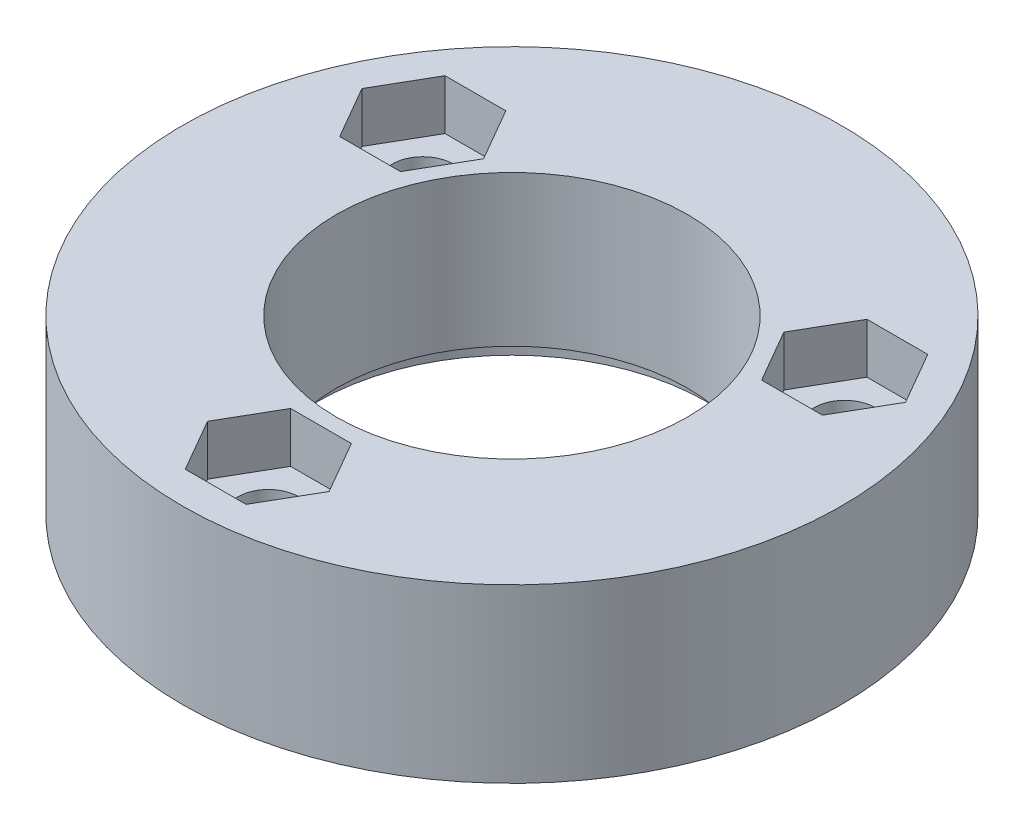
ISO-10303-21;
HEADER;
FILE_DESCRIPTION(('STEP AP214'),'2;1');
FILE_NAME('part.step','',(''),(''),'','','');
FILE_SCHEMA(('AUTOMOTIVE_DESIGN { 1 0 10303 214 1 1 1 1 }'));
ENDSEC;
DATA;
#1=APPLICATION_CONTEXT('core data for automotive mechanical design processes');
#2=APPLICATION_PROTOCOL_DEFINITION('international standard','automotive_design',2000,#1);
#3=PRODUCT_CONTEXT('',#1,'mechanical');
#4=PRODUCT('Part','Part','',(#3));
#5=PRODUCT_RELATED_PRODUCT_CATEGORY('part','',(#4));
#6=PRODUCT_DEFINITION_FORMATION('','',#4);
#7=PRODUCT_DEFINITION_CONTEXT('part definition',#1,'design');
#8=PRODUCT_DEFINITION('design','',#6,#7);
#9=PRODUCT_DEFINITION_SHAPE('','',#8);
#10=(LENGTH_UNIT() NAMED_UNIT(*) SI_UNIT(.MILLI.,.METRE.));
#11=(NAMED_UNIT(*) PLANE_ANGLE_UNIT() SI_UNIT($,.RADIAN.));
#12=(NAMED_UNIT(*) SI_UNIT($,.STERADIAN.) SOLID_ANGLE_UNIT());
#13=UNCERTAINTY_MEASURE_WITH_UNIT(LENGTH_MEASURE(1.E-05),#10,'distance_accuracy_value','');
#14=(GEOMETRIC_REPRESENTATION_CONTEXT(3) GLOBAL_UNCERTAINTY_ASSIGNED_CONTEXT((#13)) GLOBAL_UNIT_ASSIGNED_CONTEXT((#10,
#11,#12)) REPRESENTATION_CONTEXT('',''));
#15=CARTESIAN_POINT('',(0.,0.,0.));
#16=DIRECTION('',(0.,0.,1.));
#17=DIRECTION('',(1.,0.,0.));
#18=AXIS2_PLACEMENT_3D('',#15,#16,#17);
#19=CARTESIAN_POINT('',(14.7224318643355,0.,-8.49999999999986));
#20=DIRECTION('',(0.,1.,0.));
#21=DIRECTION('',(0.,0.,1.));
#22=AXIS2_PLACEMENT_3D('',#19,#20,#21);
#23=CYLINDRICAL_SURFACE('',#22,2.125);
#24=CARTESIAN_POINT('',(14.7224318643355,0.,-8.49999999999986));
#25=DIRECTION('',(0.,1.,0.));
#26=DIRECTION('',(0.,0.,1.));
#27=AXIS2_PLACEMENT_3D('',#24,#25,#26);
#28=CIRCLE('',#27,2.125);
#29=CARTESIAN_POINT('',(14.7224318643355,0.,-6.37499999999986));
#30=VERTEX_POINT('',#29);
#31=EDGE_CURVE('E391',#30,#30,#28,.T.);
#32=ORIENTED_EDGE('',*,*,#31,.F.);
#33=EDGE_LOOP('',(#32));
#34=FACE_BOUND('',#33,.T.);
#35=CARTESIAN_POINT('',(14.7224318643355,8.5,-8.49999999999986));
#36=DIRECTION('',(0.,1.,0.));
#37=DIRECTION('',(0.,0.,1.));
#38=AXIS2_PLACEMENT_3D('',#35,#36,#37);
#39=CIRCLE('',#38,2.125);
#40=CARTESIAN_POINT('',(14.7224318643355,8.5,-6.37499999999986));
#41=VERTEX_POINT('',#40);
#42=EDGE_CURVE('E53',#41,#41,#39,.F.);
#43=ORIENTED_EDGE('',*,*,#42,.F.);
#44=EDGE_LOOP('',(#43));
#45=FACE_BOUND('',#44,.T.);
#46=ADVANCED_FACE('F49',(#34,#45),#23,.F.);
#47=CARTESIAN_POINT('',(-14.7224318643354,0.,-8.50000000000007));
#48=DIRECTION('',(0.,1.,0.));
#49=DIRECTION('',(0.,0.,1.));
#50=AXIS2_PLACEMENT_3D('',#47,#48,#49);
#51=CYLINDRICAL_SURFACE('',#50,2.125);
#52=CARTESIAN_POINT('',(-14.7224318643354,0.,-8.50000000000007));
#53=DIRECTION('',(0.,1.,0.));
#54=DIRECTION('',(0.,0.,1.));
#55=AXIS2_PLACEMENT_3D('',#52,#53,#54);
#56=CIRCLE('',#55,2.125);
#57=CARTESIAN_POINT('',(-14.7224318643354,0.,-6.37500000000007));
#58=VERTEX_POINT('',#57);
#59=EDGE_CURVE('E387',#58,#58,#56,.T.);
#60=ORIENTED_EDGE('',*,*,#59,.F.);
#61=EDGE_LOOP('',(#60));
#62=FACE_BOUND('',#61,.T.);
#63=CARTESIAN_POINT('',(-14.7224318643354,8.5,-8.50000000000007));
#64=DIRECTION('',(0.,1.,0.));
#65=DIRECTION('',(0.,0.,1.));
#66=AXIS2_PLACEMENT_3D('',#63,#64,#65);
#67=CIRCLE('',#66,2.125);
#68=CARTESIAN_POINT('',(-14.7224318643354,8.5,-6.37500000000007));
#69=VERTEX_POINT('',#68);
#70=EDGE_CURVE('E415',#69,#69,#67,.F.);
#71=ORIENTED_EDGE('',*,*,#70,.F.);
#72=EDGE_LOOP('',(#71));
#73=FACE_BOUND('',#72,.T.);
#74=ADVANCED_FACE('F429',(#62,#73),#51,.F.);
#75=CARTESIAN_POINT('',(0.,0.,17.));
#76=DIRECTION('',(0.,1.,0.));
#77=DIRECTION('',(0.,0.,1.));
#78=AXIS2_PLACEMENT_3D('',#75,#76,#77);
#79=CYLINDRICAL_SURFACE('',#78,2.125);
#80=CARTESIAN_POINT('',(0.,0.,17.));
#81=DIRECTION('',(0.,1.,0.));
#82=DIRECTION('',(0.,0.,1.));
#83=AXIS2_PLACEMENT_3D('',#80,#81,#82);
#84=CIRCLE('',#83,2.125);
#85=CARTESIAN_POINT('',(0.,0.,19.125));
#86=VERTEX_POINT('',#85);
#87=EDGE_CURVE('E382',#86,#86,#84,.T.);
#88=ORIENTED_EDGE('',*,*,#87,.F.);
#89=EDGE_LOOP('',(#88));
#90=FACE_BOUND('',#89,.T.);
#91=CARTESIAN_POINT('',(0.,8.5,17.));
#92=DIRECTION('',(0.,1.,0.));
#93=DIRECTION('',(0.,0.,1.));
#94=AXIS2_PLACEMENT_3D('',#91,#92,#93);
#95=CIRCLE('',#94,2.125);
#96=CARTESIAN_POINT('',(0.,8.5,19.125));
#97=VERTEX_POINT('',#96);
#98=EDGE_CURVE('E241',#97,#97,#95,.F.);
#99=ORIENTED_EDGE('',*,*,#98,.F.);
#100=EDGE_LOOP('',(#99));
#101=FACE_BOUND('',#100,.T.);
#102=ADVANCED_FACE('F434',(#90,#101),#79,.F.);
#103=CARTESIAN_POINT('',(0.,12.,0.));
#104=DIRECTION('',(0.,-1.,0.));
#105=DIRECTION('',(0.,0.,-1.));
#106=AXIS2_PLACEMENT_3D('',#103,#104,#105);
#107=CYLINDRICAL_SURFACE('',#106,12.25);
#108=CARTESIAN_POINT('',(0.,12.,0.));
#109=DIRECTION('',(0.,1.,0.));
#110=DIRECTION('',(0.,0.,1.));
#111=AXIS2_PLACEMENT_3D('',#108,#109,#110);
#112=CIRCLE('',#111,12.25);
#113=CARTESIAN_POINT('',(0.,12.,12.25));
#114=VERTEX_POINT('',#113);
#115=EDGE_CURVE('E403',#114,#114,#112,.T.);
#116=ORIENTED_EDGE('',*,*,#115,.T.);
#117=EDGE_LOOP('',(#116));
#118=FACE_BOUND('',#117,.T.);
#119=CARTESIAN_POINT('',(0.,1.5,0.));
#120=DIRECTION('',(0.,-1.,0.));
#121=DIRECTION('',(0.,0.,-1.));
#122=AXIS2_PLACEMENT_3D('',#119,#120,#121);
#123=CIRCLE('',#122,12.25);
#124=CARTESIAN_POINT('',(0.,1.5,-12.25));
#125=VERTEX_POINT('',#124);
#126=EDGE_CURVE('E399',#125,#125,#123,.T.);
#127=ORIENTED_EDGE('',*,*,#126,.T.);
#128=EDGE_LOOP('',(#127));
#129=FACE_BOUND('',#128,.T.);
#130=ADVANCED_FACE('F448',(#118,#129),#107,.F.);
#131=CARTESIAN_POINT('',(0.,12.,0.));
#132=DIRECTION('',(0.,1.,0.));
#133=DIRECTION('',(0.,0.,1.));
#134=AXIS2_PLACEMENT_3D('',#131,#132,#133);
#135=PLANE('',#134);
#136=DIRECTION('',(0.5,0.,-0.866025403784439));
#137=VECTOR('',#136,1.);
#138=CARTESIAN_POINT('',(2.12176223927187,12.,20.675));
#139=LINE('',#138,#137);
#140=CARTESIAN_POINT('',(2.12176223927187,12.,20.675));
#141=VERTEX_POINT('',#140);
#142=CARTESIAN_POINT('',(4.24352447854375,12.,17.));
#143=VERTEX_POINT('',#142);
#144=EDGE_CURVE('E67',#141,#143,#139,.T.);
#145=ORIENTED_EDGE('',*,*,#144,.F.);
#146=DIRECTION('',(1.,0.,0.));
#147=VECTOR('',#146,1.);
#148=CARTESIAN_POINT('',(-2.12176223927188,12.,20.675));
#149=LINE('',#148,#147);
#150=CARTESIAN_POINT('',(-2.12176223927188,12.,20.675));
#151=VERTEX_POINT('',#150);
#152=EDGE_CURVE('E202',#151,#141,#149,.T.);
#153=ORIENTED_EDGE('',*,*,#152,.F.);
#154=DIRECTION('',(0.5,0.,0.866025403784439));
#155=VECTOR('',#154,1.);
#156=CARTESIAN_POINT('',(-4.24352447854375,12.,17.));
#157=LINE('',#156,#155);
#158=CARTESIAN_POINT('',(-4.24352447854375,12.,17.));
#159=VERTEX_POINT('',#158);
#160=EDGE_CURVE('E209',#159,#151,#157,.T.);
#161=ORIENTED_EDGE('',*,*,#160,.F.);
#162=DIRECTION('',(-0.5,0.,0.866025403784439));
#163=VECTOR('',#162,1.);
#164=CARTESIAN_POINT('',(-2.12176223927187,12.,13.325));
#165=LINE('',#164,#163);
#166=CARTESIAN_POINT('',(-2.12176223927187,12.,13.325));
#167=VERTEX_POINT('',#166);
#168=EDGE_CURVE('E231',#167,#159,#165,.T.);
#169=ORIENTED_EDGE('',*,*,#168,.F.);
#170=DIRECTION('',(-1.,0.,0.));
#171=VECTOR('',#170,1.);
#172=CARTESIAN_POINT('',(2.12176223927187,12.,13.325));
#173=LINE('',#172,#171);
#174=CARTESIAN_POINT('',(2.12176223927187,12.,13.325));
#175=VERTEX_POINT('',#174);
#176=EDGE_CURVE('E227',#175,#167,#173,.T.);
#177=ORIENTED_EDGE('',*,*,#176,.F.);
#178=DIRECTION('',(-0.5,0.,-0.866025403784438));
#179=VECTOR('',#178,1.);
#180=CARTESIAN_POINT('',(4.24352447854375,12.,17.));
#181=LINE('',#180,#179);
#182=EDGE_CURVE('E224',#143,#175,#181,.T.);
#183=ORIENTED_EDGE('',*,*,#182,.F.);
#184=EDGE_LOOP('',(#145,#153,#161,#169,#177,#183));
#185=FACE_BOUND('',#184,.T.);
#186=DIRECTION('',(0.499999999999996,0.,0.866025403784441));
#187=VECTOR('',#186,1.);
#188=CARTESIAN_POINT('',(-18.9659563428792,12.,-8.50000000000009));
#189=LINE('',#188,#187);
#190=CARTESIAN_POINT('',(-18.9659563428792,12.,-8.50000000000009));
#191=VERTEX_POINT('',#190);
#192=CARTESIAN_POINT('',(-16.8441941036073,12.,-4.82500000000008));
#193=VERTEX_POINT('',#192);
#194=EDGE_CURVE('E75',#191,#193,#189,.T.);
#195=ORIENTED_EDGE('',*,*,#194,.F.);
#196=DIRECTION('',(-0.500000000000004,0.,0.866025403784436));
#197=VECTOR('',#196,1.);
#198=CARTESIAN_POINT('',(-16.8441941036073,12.,-12.1750000000001));
#199=LINE('',#198,#197);
#200=CARTESIAN_POINT('',(-16.8441941036073,12.,-12.1750000000001));
#201=VERTEX_POINT('',#200);
#202=EDGE_CURVE('E273',#201,#191,#199,.T.);
#203=ORIENTED_EDGE('',*,*,#202,.F.);
#204=DIRECTION('',(-1.,0.,0.));
#205=VECTOR('',#204,1.);
#206=CARTESIAN_POINT('',(-12.6006696250635,12.,-12.1750000000001));
#207=LINE('',#206,#205);
#208=CARTESIAN_POINT('',(-12.6006696250635,12.,-12.1750000000001));
#209=VERTEX_POINT('',#208);
#210=EDGE_CURVE('E277',#209,#201,#207,.T.);
#211=ORIENTED_EDGE('',*,*,#210,.F.);
#212=DIRECTION('',(-0.499999999999996,0.,-0.866025403784441));
#213=VECTOR('',#212,1.);
#214=CARTESIAN_POINT('',(-10.4789073857917,12.,-8.50000000000005));
#215=LINE('',#214,#213);
#216=CARTESIAN_POINT('',(-10.4789073857917,12.,-8.50000000000005));
#217=VERTEX_POINT('',#216);
#218=EDGE_CURVE('E282',#217,#209,#215,.T.);
#219=ORIENTED_EDGE('',*,*,#218,.F.);
#220=DIRECTION('',(0.500000000000004,0.,-0.866025403784436));
#221=VECTOR('',#220,1.);
#222=CARTESIAN_POINT('',(-12.6006696250636,12.,-4.82500000000006));
#223=LINE('',#222,#221);
#224=CARTESIAN_POINT('',(-12.6006696250636,12.,-4.82500000000006));
#225=VERTEX_POINT('',#224);
#226=EDGE_CURVE('E286',#225,#217,#223,.T.);
#227=ORIENTED_EDGE('',*,*,#226,.F.);
#228=DIRECTION('',(1.,0.,0.));
#229=VECTOR('',#228,1.);
#230=CARTESIAN_POINT('',(-16.8441941036073,12.,-4.82500000000008));
#231=LINE('',#230,#229);
#232=EDGE_CURVE('E290',#193,#225,#231,.T.);
#233=ORIENTED_EDGE('',*,*,#232,.F.);
#234=EDGE_LOOP('',(#195,#203,#211,#219,#227,#233));
#235=FACE_BOUND('',#234,.T.);
#236=DIRECTION('',(-1.,0.,0.));
#237=VECTOR('',#236,1.);
#238=CARTESIAN_POINT('',(16.8441941036074,12.,-12.1749999999998));
#239=LINE('',#238,#237);
#240=CARTESIAN_POINT('',(16.8441941036074,12.,-12.1749999999998));
#241=VERTEX_POINT('',#240);
#242=CARTESIAN_POINT('',(12.6006696250637,12.,-12.1749999999999));
#243=VERTEX_POINT('',#242);
#244=EDGE_CURVE('E272',#241,#243,#239,.T.);
#245=ORIENTED_EDGE('',*,*,#244,.F.);
#246=DIRECTION('',(-0.499999999999992,0.,-0.866025403784443));
#247=VECTOR('',#246,1.);
#248=CARTESIAN_POINT('',(18.9659563428793,12.,-8.49999999999982));
#249=LINE('',#248,#247);
#250=CARTESIAN_POINT('',(18.9659563428793,12.,-8.49999999999982));
#251=VERTEX_POINT('',#250);
#252=EDGE_CURVE('E337',#251,#241,#249,.T.);
#253=ORIENTED_EDGE('',*,*,#252,.F.);
#254=DIRECTION('',(0.500000000000009,0.,-0.866025403784434));
#255=VECTOR('',#254,1.);
#256=CARTESIAN_POINT('',(16.8441941036074,12.,-4.82499999999985));
#257=LINE('',#256,#255);
#258=CARTESIAN_POINT('',(16.8441941036074,12.,-4.82499999999985));
#259=VERTEX_POINT('',#258);
#260=EDGE_CURVE('E341',#259,#251,#257,.T.);
#261=ORIENTED_EDGE('',*,*,#260,.F.);
#262=DIRECTION('',(1.,0.,0.));
#263=VECTOR('',#262,1.);
#264=CARTESIAN_POINT('',(12.6006696250636,12.,-4.82499999999988));
#265=LINE('',#264,#263);
#266=CARTESIAN_POINT('',(12.6006696250636,12.,-4.82499999999988));
#267=VERTEX_POINT('',#266);
#268=EDGE_CURVE('E346',#267,#259,#265,.T.);
#269=ORIENTED_EDGE('',*,*,#268,.F.);
#270=DIRECTION('',(0.499999999999992,0.,0.866025403784443));
#271=VECTOR('',#270,1.);
#272=CARTESIAN_POINT('',(10.4789073857918,12.,-8.4999999999999));
#273=LINE('',#272,#271);
#274=CARTESIAN_POINT('',(10.4789073857918,12.,-8.4999999999999));
#275=VERTEX_POINT('',#274);
#276=EDGE_CURVE('E350',#275,#267,#273,.T.);
#277=ORIENTED_EDGE('',*,*,#276,.F.);
#278=DIRECTION('',(-0.500000000000007,0.,0.866025403784434));
#279=VECTOR('',#278,1.);
#280=CARTESIAN_POINT('',(12.6006696250637,12.,-12.1749999999999));
#281=LINE('',#280,#279);
#282=EDGE_CURVE('E354',#243,#275,#281,.T.);
#283=ORIENTED_EDGE('',*,*,#282,.F.);
#284=EDGE_LOOP('',(#245,#253,#261,#269,#277,#283));
#285=FACE_BOUND('',#284,.T.);
#286=CARTESIAN_POINT('',(0.,12.,0.));
#287=DIRECTION('',(0.,1.,0.));
#288=DIRECTION('',(0.,0.,1.));
#289=AXIS2_PLACEMENT_3D('',#286,#287,#288);
#290=CIRCLE('',#289,23.);
#291=CARTESIAN_POINT('',(0.,12.,23.));
#292=VERTEX_POINT('',#291);
#293=EDGE_CURVE('E11',#292,#292,#290,.T.);
#294=ORIENTED_EDGE('',*,*,#293,.T.);
#295=EDGE_LOOP('',(#294));
#296=FACE_BOUND('',#295,.T.);
#297=ORIENTED_EDGE('',*,*,#115,.F.);
#298=EDGE_LOOP('',(#297));
#299=FACE_BOUND('',#298,.T.);
#300=ADVANCED_FACE('F451',(#185,#235,#285,#296,#299),#135,.T.);
#301=CARTESIAN_POINT('',(0.,0.,0.));
#302=DIRECTION('',(0.,1.,0.));
#303=DIRECTION('',(0.,0.,1.));
#304=AXIS2_PLACEMENT_3D('',#301,#302,#303);
#305=PLANE('',#304);
#306=ORIENTED_EDGE('',*,*,#87,.T.);
#307=EDGE_LOOP('',(#306));
#308=FACE_BOUND('',#307,.T.);
#309=ORIENTED_EDGE('',*,*,#59,.T.);
#310=EDGE_LOOP('',(#309));
#311=FACE_BOUND('',#310,.T.);
#312=ORIENTED_EDGE('',*,*,#31,.T.);
#313=EDGE_LOOP('',(#312));
#314=FACE_BOUND('',#313,.T.);
#315=CARTESIAN_POINT('',(0.,0.,0.));
#316=DIRECTION('',(0.,-1.,0.));
#317=DIRECTION('',(0.,0.,-1.));
#318=AXIS2_PLACEMENT_3D('',#315,#316,#317);
#319=CIRCLE('',#318,13.6);
#320=CARTESIAN_POINT('',(0.,0.,-13.6));
#321=VERTEX_POINT('',#320);
#322=EDGE_CURVE('E386',#321,#321,#319,.T.);
#323=ORIENTED_EDGE('',*,*,#322,.F.);
#324=EDGE_LOOP('',(#323));
#325=FACE_BOUND('',#324,.T.);
#326=CARTESIAN_POINT('',(0.,0.,0.));
#327=DIRECTION('',(0.,1.,0.));
#328=DIRECTION('',(0.,0.,1.));
#329=AXIS2_PLACEMENT_3D('',#326,#327,#328);
#330=CIRCLE('',#329,23.);
#331=CARTESIAN_POINT('',(0.,0.,23.));
#332=VERTEX_POINT('',#331);
#333=EDGE_CURVE('E59',#332,#332,#330,.T.);
#334=ORIENTED_EDGE('',*,*,#333,.F.);
#335=EDGE_LOOP('',(#334));
#336=FACE_BOUND('',#335,.T.);
#337=ADVANCED_FACE('F454',(#308,#311,#314,#325,#336),#305,.F.);
#338=CARTESIAN_POINT('',(0.,12.,0.));
#339=DIRECTION('',(0.,-1.,0.));
#340=DIRECTION('',(0.,0.,-1.));
#341=AXIS2_PLACEMENT_3D('',#338,#339,#340);
#342=CYLINDRICAL_SURFACE('',#341,23.);
#343=ORIENTED_EDGE('',*,*,#293,.F.);
#344=EDGE_LOOP('',(#343));
#345=FACE_BOUND('',#344,.T.);
#346=ORIENTED_EDGE('',*,*,#333,.T.);
#347=EDGE_LOOP('',(#346));
#348=FACE_BOUND('',#347,.T.);
#349=ADVANCED_FACE('F51',(#345,#348),#342,.T.);
#350=CARTESIAN_POINT('',(0.,1.5,0.));
#351=DIRECTION('',(0.,-1.,0.));
#352=DIRECTION('',(0.,0.,-1.));
#353=AXIS2_PLACEMENT_3D('',#350,#351,#352);
#354=CYLINDRICAL_SURFACE('',#353,13.6);
#355=CARTESIAN_POINT('',(0.,1.5,0.));
#356=DIRECTION('',(0.,-1.,0.));
#357=DIRECTION('',(0.,0.,-1.));
#358=AXIS2_PLACEMENT_3D('',#355,#356,#357);
#359=CIRCLE('',#358,13.6);
#360=CARTESIAN_POINT('',(0.,1.5,-13.6));
#361=VERTEX_POINT('',#360);
#362=EDGE_CURVE('E395',#361,#361,#359,.T.);
#363=ORIENTED_EDGE('',*,*,#362,.F.);
#364=EDGE_LOOP('',(#363));
#365=FACE_BOUND('',#364,.T.);
#366=ORIENTED_EDGE('',*,*,#322,.T.);
#367=EDGE_LOOP('',(#366));
#368=FACE_BOUND('',#367,.T.);
#369=ADVANCED_FACE('F443',(#365,#368),#354,.F.);
#370=CARTESIAN_POINT('',(0.,1.5,0.));
#371=DIRECTION('',(0.,-1.,0.));
#372=DIRECTION('',(0.,0.,-1.));
#373=AXIS2_PLACEMENT_3D('',#370,#371,#372);
#374=PLANE('',#373);
#375=ORIENTED_EDGE('',*,*,#126,.F.);
#376=EDGE_LOOP('',(#375));
#377=FACE_BOUND('',#376,.T.);
#378=ORIENTED_EDGE('',*,*,#362,.T.);
#379=EDGE_LOOP('',(#378));
#380=FACE_BOUND('',#379,.T.);
#381=ADVANCED_FACE('F440',(#377,#380),#374,.T.);
#382=CARTESIAN_POINT('',(0.,8.5,0.));
#383=DIRECTION('',(0.,1.,0.));
#384=DIRECTION('',(0.,0.,1.));
#385=AXIS2_PLACEMENT_3D('',#382,#383,#384);
#386=PLANE('',#385);
#387=DIRECTION('',(0.5,0.,-0.866025403784439));
#388=VECTOR('',#387,1.);
#389=CARTESIAN_POINT('',(2.12176223927187,8.5,20.675));
#390=LINE('',#389,#388);
#391=CARTESIAN_POINT('',(2.12176223927187,8.5,20.675));
#392=VERTEX_POINT('',#391);
#393=CARTESIAN_POINT('',(4.24352447854375,8.5,17.));
#394=VERTEX_POINT('',#393);
#395=EDGE_CURVE('E179',#392,#394,#390,.T.);
#396=ORIENTED_EDGE('',*,*,#395,.T.);
#397=DIRECTION('',(-0.5,0.,-0.866025403784438));
#398=VECTOR('',#397,1.);
#399=CARTESIAN_POINT('',(4.24352447854375,8.5,17.));
#400=LINE('',#399,#398);
#401=CARTESIAN_POINT('',(2.12176223927187,8.5,13.325));
#402=VERTEX_POINT('',#401);
#403=EDGE_CURVE('E189',#394,#402,#400,.T.);
#404=ORIENTED_EDGE('',*,*,#403,.T.);
#405=DIRECTION('',(-1.,0.,0.));
#406=VECTOR('',#405,1.);
#407=CARTESIAN_POINT('',(2.12176223927187,8.5,13.325));
#408=LINE('',#407,#406);
#409=CARTESIAN_POINT('',(-2.12176223927187,8.5,13.325));
#410=VERTEX_POINT('',#409);
#411=EDGE_CURVE('E195',#402,#410,#408,.T.);
#412=ORIENTED_EDGE('',*,*,#411,.T.);
#413=DIRECTION('',(-0.5,0.,0.866025403784439));
#414=VECTOR('',#413,1.);
#415=CARTESIAN_POINT('',(-2.12176223927187,8.5,13.325));
#416=LINE('',#415,#414);
#417=CARTESIAN_POINT('',(-4.24352447854375,8.5,17.));
#418=VERTEX_POINT('',#417);
#419=EDGE_CURVE('E214',#410,#418,#416,.T.);
#420=ORIENTED_EDGE('',*,*,#419,.T.);
#421=DIRECTION('',(0.5,0.,0.866025403784439));
#422=VECTOR('',#421,1.);
#423=CARTESIAN_POINT('',(-4.24352447854375,8.5,17.));
#424=LINE('',#423,#422);
#425=CARTESIAN_POINT('',(-2.12176223927188,8.5,20.675));
#426=VERTEX_POINT('',#425);
#427=EDGE_CURVE('E218',#418,#426,#424,.T.);
#428=ORIENTED_EDGE('',*,*,#427,.T.);
#429=DIRECTION('',(1.,0.,0.));
#430=VECTOR('',#429,1.);
#431=CARTESIAN_POINT('',(-2.12176223927188,8.5,20.675));
#432=LINE('',#431,#430);
#433=EDGE_CURVE('E186',#426,#392,#432,.T.);
#434=ORIENTED_EDGE('',*,*,#433,.T.);
#435=EDGE_LOOP('',(#396,#404,#412,#420,#428,#434));
#436=FACE_BOUND('',#435,.T.);
#437=ORIENTED_EDGE('',*,*,#98,.T.);
#438=EDGE_LOOP('',(#437));
#439=FACE_BOUND('',#438,.T.);
#440=ADVANCED_FACE('F197',(#436,#439),#386,.T.);
#441=CARTESIAN_POINT('',(2.12176223927187,8.5,20.675));
#442=DIRECTION('',(0.866025403784439,0.,0.5));
#443=DIRECTION('',(0.5,0.,-0.866025403784439));
#444=AXIS2_PLACEMENT_3D('',#441,#442,#443);
#445=PLANE('',#444);
#446=ORIENTED_EDGE('',*,*,#144,.T.);
#447=DIRECTION('',(0.,1.,0.));
#448=VECTOR('',#447,1.);
#449=CARTESIAN_POINT('',(4.24352447854375,8.5,17.));
#450=LINE('',#449,#448);
#451=EDGE_CURVE('E175',#394,#143,#450,.T.);
#452=ORIENTED_EDGE('',*,*,#451,.F.);
#453=ORIENTED_EDGE('',*,*,#395,.F.);
#454=DIRECTION('',(0.,1.,0.));
#455=VECTOR('',#454,1.);
#456=CARTESIAN_POINT('',(2.12176223927187,8.5,20.675));
#457=LINE('',#456,#455);
#458=EDGE_CURVE('E238',#392,#141,#457,.T.);
#459=ORIENTED_EDGE('',*,*,#458,.T.);
#460=EDGE_LOOP('',(#446,#452,#453,#459));
#461=FACE_BOUND('',#460,.T.);
#462=ADVANCED_FACE('F177',(#461),#445,.F.);
#463=CARTESIAN_POINT('',(-2.12176223927188,8.5,20.675));
#464=DIRECTION('',(0.,0.,1.));
#465=DIRECTION('',(1.,0.,0.));
#466=AXIS2_PLACEMENT_3D('',#463,#464,#465);
#467=PLANE('',#466);
#468=ORIENTED_EDGE('',*,*,#152,.T.);
#469=ORIENTED_EDGE('',*,*,#458,.F.);
#470=ORIENTED_EDGE('',*,*,#433,.F.);
#471=DIRECTION('',(0.,1.,0.));
#472=VECTOR('',#471,1.);
#473=CARTESIAN_POINT('',(-2.12176223927188,8.5,20.675));
#474=LINE('',#473,#472);
#475=EDGE_CURVE('E242',#426,#151,#474,.T.);
#476=ORIENTED_EDGE('',*,*,#475,.T.);
#477=EDGE_LOOP('',(#468,#469,#470,#476));
#478=FACE_BOUND('',#477,.T.);
#479=ADVANCED_FACE('F480',(#478),#467,.F.);
#480=CARTESIAN_POINT('',(-4.24352447854375,8.5,17.));
#481=DIRECTION('',(-0.866025403784439,0.,0.5));
#482=DIRECTION('',(0.5,0.,0.866025403784439));
#483=AXIS2_PLACEMENT_3D('',#480,#481,#482);
#484=PLANE('',#483);
#485=ORIENTED_EDGE('',*,*,#160,.T.);
#486=ORIENTED_EDGE('',*,*,#475,.F.);
#487=ORIENTED_EDGE('',*,*,#427,.F.);
#488=DIRECTION('',(0.,1.,0.));
#489=VECTOR('',#488,1.);
#490=CARTESIAN_POINT('',(-4.24352447854375,8.5,17.));
#491=LINE('',#490,#489);
#492=EDGE_CURVE('E245',#418,#159,#491,.T.);
#493=ORIENTED_EDGE('',*,*,#492,.T.);
#494=EDGE_LOOP('',(#485,#486,#487,#493));
#495=FACE_BOUND('',#494,.T.);
#496=ADVANCED_FACE('F485',(#495),#484,.F.);
#497=CARTESIAN_POINT('',(-2.12176223927187,8.5,13.325));
#498=DIRECTION('',(-0.866025403784439,0.,-0.5));
#499=DIRECTION('',(-0.5,0.,0.866025403784439));
#500=AXIS2_PLACEMENT_3D('',#497,#498,#499);
#501=PLANE('',#500);
#502=ORIENTED_EDGE('',*,*,#168,.T.);
#503=ORIENTED_EDGE('',*,*,#492,.F.);
#504=ORIENTED_EDGE('',*,*,#419,.F.);
#505=DIRECTION('',(0.,1.,0.));
#506=VECTOR('',#505,1.);
#507=CARTESIAN_POINT('',(-2.12176223927187,8.5,13.325));
#508=LINE('',#507,#506);
#509=EDGE_CURVE('E248',#410,#167,#508,.T.);
#510=ORIENTED_EDGE('',*,*,#509,.T.);
#511=EDGE_LOOP('',(#502,#503,#504,#510));
#512=FACE_BOUND('',#511,.T.);
#513=ADVANCED_FACE('F489',(#512),#501,.F.);
#514=CARTESIAN_POINT('',(2.12176223927187,8.5,13.325));
#515=DIRECTION('',(0.,0.,-1.));
#516=DIRECTION('',(-1.,0.,0.));
#517=AXIS2_PLACEMENT_3D('',#514,#515,#516);
#518=PLANE('',#517);
#519=ORIENTED_EDGE('',*,*,#176,.T.);
#520=ORIENTED_EDGE('',*,*,#509,.F.);
#521=ORIENTED_EDGE('',*,*,#411,.F.);
#522=DIRECTION('',(0.,1.,0.));
#523=VECTOR('',#522,1.);
#524=CARTESIAN_POINT('',(2.12176223927187,8.5,13.325));
#525=LINE('',#524,#523);
#526=EDGE_CURVE('E185',#402,#175,#525,.T.);
#527=ORIENTED_EDGE('',*,*,#526,.T.);
#528=EDGE_LOOP('',(#519,#520,#521,#527));
#529=FACE_BOUND('',#528,.T.);
#530=ADVANCED_FACE('F493',(#529),#518,.F.);
#531=CARTESIAN_POINT('',(4.24352447854375,8.5,17.));
#532=DIRECTION('',(0.866025403784438,0.,-0.5));
#533=DIRECTION('',(-0.5,0.,-0.866025403784439));
#534=AXIS2_PLACEMENT_3D('',#531,#532,#533);
#535=PLANE('',#534);
#536=ORIENTED_EDGE('',*,*,#182,.T.);
#537=ORIENTED_EDGE('',*,*,#526,.F.);
#538=ORIENTED_EDGE('',*,*,#403,.F.);
#539=ORIENTED_EDGE('',*,*,#451,.T.);
#540=EDGE_LOOP('',(#536,#537,#538,#539));
#541=FACE_BOUND('',#540,.T.);
#542=ADVANCED_FACE('F190',(#541),#535,.F.);
#543=CARTESIAN_POINT('',(0.,8.5,0.));
#544=DIRECTION('',(0.,1.,0.));
#545=DIRECTION('',(0.,0.,1.));
#546=AXIS2_PLACEMENT_3D('',#543,#544,#545);
#547=PLANE('',#546);
#548=DIRECTION('',(0.499999999999996,0.,0.866025403784441));
#549=VECTOR('',#548,1.);
#550=CARTESIAN_POINT('',(-18.9659563428792,8.5,-8.50000000000009));
#551=LINE('',#550,#549);
#552=CARTESIAN_POINT('',(-18.9659563428792,8.5,-8.50000000000009));
#553=VERTEX_POINT('',#552);
#554=CARTESIAN_POINT('',(-16.8441941036073,8.5,-4.82500000000008));
#555=VERTEX_POINT('',#554);
#556=EDGE_CURVE('E278',#553,#555,#551,.T.);
#557=ORIENTED_EDGE('',*,*,#556,.T.);
#558=DIRECTION('',(1.,0.,0.));
#559=VECTOR('',#558,1.);
#560=CARTESIAN_POINT('',(-16.8441941036073,8.5,-4.82500000000008));
#561=LINE('',#560,#559);
#562=CARTESIAN_POINT('',(-12.6006696250636,8.5,-4.82500000000006));
#563=VERTEX_POINT('',#562);
#564=EDGE_CURVE('E311',#555,#563,#561,.T.);
#565=ORIENTED_EDGE('',*,*,#564,.T.);
#566=DIRECTION('',(0.500000000000004,0.,-0.866025403784436));
#567=VECTOR('',#566,1.);
#568=CARTESIAN_POINT('',(-12.6006696250636,8.5,-4.82500000000006));
#569=LINE('',#568,#567);
#570=CARTESIAN_POINT('',(-10.4789073857917,8.5,-8.50000000000005));
#571=VERTEX_POINT('',#570);
#572=EDGE_CURVE('E307',#563,#571,#569,.T.);
#573=ORIENTED_EDGE('',*,*,#572,.T.);
#574=DIRECTION('',(-0.499999999999996,0.,-0.866025403784441));
#575=VECTOR('',#574,1.);
#576=CARTESIAN_POINT('',(-10.4789073857917,8.5,-8.50000000000005));
#577=LINE('',#576,#575);
#578=CARTESIAN_POINT('',(-12.6006696250635,8.5,-12.1750000000001));
#579=VERTEX_POINT('',#578);
#580=EDGE_CURVE('E303',#571,#579,#577,.T.);
#581=ORIENTED_EDGE('',*,*,#580,.T.);
#582=DIRECTION('',(-1.,0.,0.));
#583=VECTOR('',#582,1.);
#584=CARTESIAN_POINT('',(-12.6006696250635,8.5,-12.1750000000001));
#585=LINE('',#584,#583);
#586=CARTESIAN_POINT('',(-16.8441941036073,8.5,-12.1750000000001));
#587=VERTEX_POINT('',#586);
#588=EDGE_CURVE('E299',#579,#587,#585,.T.);
#589=ORIENTED_EDGE('',*,*,#588,.T.);
#590=DIRECTION('',(-0.500000000000004,0.,0.866025403784436));
#591=VECTOR('',#590,1.);
#592=CARTESIAN_POINT('',(-16.8441941036073,8.5,-12.1750000000001));
#593=LINE('',#592,#591);
#594=EDGE_CURVE('E256',#587,#553,#593,.T.);
#595=ORIENTED_EDGE('',*,*,#594,.T.);
#596=EDGE_LOOP('',(#557,#565,#573,#581,#589,#595));
#597=FACE_BOUND('',#596,.T.);
#598=ORIENTED_EDGE('',*,*,#70,.T.);
#599=EDGE_LOOP('',(#598));
#600=FACE_BOUND('',#599,.T.);
#601=ADVANCED_FACE('F499',(#597,#600),#547,.T.);
#602=CARTESIAN_POINT('',(-18.9659563428792,8.5,-8.50000000000009));
#603=DIRECTION('',(-0.866025403784441,0.,0.499999999999996));
#604=DIRECTION('',(0.499999999999996,0.,0.866025403784441));
#605=AXIS2_PLACEMENT_3D('',#602,#603,#604);
#606=PLANE('',#605);
#607=ORIENTED_EDGE('',*,*,#194,.T.);
#608=DIRECTION('',(0.,1.,0.));
#609=VECTOR('',#608,1.);
#610=CARTESIAN_POINT('',(-16.8441941036073,8.5,-4.82500000000008));
#611=LINE('',#610,#609);
#612=EDGE_CURVE('E253',#555,#193,#611,.T.);
#613=ORIENTED_EDGE('',*,*,#612,.F.);
#614=ORIENTED_EDGE('',*,*,#556,.F.);
#615=DIRECTION('',(0.,1.,0.));
#616=VECTOR('',#615,1.);
#617=CARTESIAN_POINT('',(-18.9659563428792,8.5,-8.50000000000009));
#618=LINE('',#617,#616);
#619=EDGE_CURVE('E269',#553,#191,#618,.T.);
#620=ORIENTED_EDGE('',*,*,#619,.T.);
#621=EDGE_LOOP('',(#607,#613,#614,#620));
#622=FACE_BOUND('',#621,.T.);
#623=ADVANCED_FACE('F501',(#622),#606,.F.);
#624=CARTESIAN_POINT('',(-16.8441941036073,8.5,-12.1750000000001));
#625=DIRECTION('',(-0.866025403784436,0.,-0.500000000000004));
#626=DIRECTION('',(-0.500000000000005,0.,0.866025403784436));
#627=AXIS2_PLACEMENT_3D('',#624,#625,#626);
#628=PLANE('',#627);
#629=ORIENTED_EDGE('',*,*,#202,.T.);
#630=ORIENTED_EDGE('',*,*,#619,.F.);
#631=ORIENTED_EDGE('',*,*,#594,.F.);
#632=DIRECTION('',(0.,1.,0.));
#633=VECTOR('',#632,1.);
#634=CARTESIAN_POINT('',(-16.8441941036073,8.5,-12.1750000000001));
#635=LINE('',#634,#633);
#636=EDGE_CURVE('E266',#587,#201,#635,.T.);
#637=ORIENTED_EDGE('',*,*,#636,.T.);
#638=EDGE_LOOP('',(#629,#630,#631,#637));
#639=FACE_BOUND('',#638,.T.);
#640=ADVANCED_FACE('F504',(#639),#628,.F.);
#641=CARTESIAN_POINT('',(-12.6006696250635,8.5,-12.1750000000001));
#642=DIRECTION('',(0.,0.,-1.));
#643=DIRECTION('',(-1.,0.,0.));
#644=AXIS2_PLACEMENT_3D('',#641,#642,#643);
#645=PLANE('',#644);
#646=ORIENTED_EDGE('',*,*,#210,.T.);
#647=ORIENTED_EDGE('',*,*,#636,.F.);
#648=ORIENTED_EDGE('',*,*,#588,.F.);
#649=DIRECTION('',(0.,1.,0.));
#650=VECTOR('',#649,1.);
#651=CARTESIAN_POINT('',(-12.6006696250635,8.5,-12.1750000000001));
#652=LINE('',#651,#650);
#653=EDGE_CURVE('E263',#579,#209,#652,.T.);
#654=ORIENTED_EDGE('',*,*,#653,.T.);
#655=EDGE_LOOP('',(#646,#647,#648,#654));
#656=FACE_BOUND('',#655,.T.);
#657=ADVANCED_FACE('F516',(#656),#645,.F.);
#658=CARTESIAN_POINT('',(-10.4789073857917,8.5,-8.50000000000005));
#659=DIRECTION('',(0.866025403784441,0.,-0.499999999999996));
#660=DIRECTION('',(-0.499999999999996,0.,-0.866025403784441));
#661=AXIS2_PLACEMENT_3D('',#658,#659,#660);
#662=PLANE('',#661);
#663=ORIENTED_EDGE('',*,*,#218,.T.);
#664=ORIENTED_EDGE('',*,*,#653,.F.);
#665=ORIENTED_EDGE('',*,*,#580,.F.);
#666=DIRECTION('',(0.,1.,0.));
#667=VECTOR('',#666,1.);
#668=CARTESIAN_POINT('',(-10.4789073857917,8.5,-8.50000000000005));
#669=LINE('',#668,#667);
#670=EDGE_CURVE('E260',#571,#217,#669,.T.);
#671=ORIENTED_EDGE('',*,*,#670,.T.);
#672=EDGE_LOOP('',(#663,#664,#665,#671));
#673=FACE_BOUND('',#672,.T.);
#674=ADVANCED_FACE('F512',(#673),#662,.F.);
#675=CARTESIAN_POINT('',(-12.6006696250636,8.5,-4.82500000000006));
#676=DIRECTION('',(0.866025403784436,0.,0.500000000000004));
#677=DIRECTION('',(0.500000000000004,0.,-0.866025403784436));
#678=AXIS2_PLACEMENT_3D('',#675,#676,#677);
#679=PLANE('',#678);
#680=ORIENTED_EDGE('',*,*,#226,.T.);
#681=ORIENTED_EDGE('',*,*,#670,.F.);
#682=ORIENTED_EDGE('',*,*,#572,.F.);
#683=DIRECTION('',(0.,1.,0.));
#684=VECTOR('',#683,1.);
#685=CARTESIAN_POINT('',(-12.6006696250636,8.5,-4.82500000000006));
#686=LINE('',#685,#684);
#687=EDGE_CURVE('E257',#563,#225,#686,.T.);
#688=ORIENTED_EDGE('',*,*,#687,.T.);
#689=EDGE_LOOP('',(#680,#681,#682,#688));
#690=FACE_BOUND('',#689,.T.);
#691=ADVANCED_FACE('F508',(#690),#679,.F.);
#692=CARTESIAN_POINT('',(-16.8441941036073,8.5,-4.82500000000008));
#693=DIRECTION('',(0.,0.,1.));
#694=DIRECTION('',(1.,0.,0.));
#695=AXIS2_PLACEMENT_3D('',#692,#693,#694);
#696=PLANE('',#695);
#697=ORIENTED_EDGE('',*,*,#232,.T.);
#698=ORIENTED_EDGE('',*,*,#687,.F.);
#699=ORIENTED_EDGE('',*,*,#564,.F.);
#700=ORIENTED_EDGE('',*,*,#612,.T.);
#701=EDGE_LOOP('',(#697,#698,#699,#700));
#702=FACE_BOUND('',#701,.T.);
#703=ADVANCED_FACE('F505',(#702),#696,.F.);
#704=CARTESIAN_POINT('',(0.,8.5,0.));
#705=DIRECTION('',(0.,1.,0.));
#706=DIRECTION('',(0.,0.,1.));
#707=AXIS2_PLACEMENT_3D('',#704,#705,#706);
#708=PLANE('',#707);
#709=DIRECTION('',(-1.,0.,0.));
#710=VECTOR('',#709,1.);
#711=CARTESIAN_POINT('',(16.8441941036074,8.5,-12.1749999999998));
#712=LINE('',#711,#710);
#713=CARTESIAN_POINT('',(16.8441941036074,8.5,-12.1749999999998));
#714=VERTEX_POINT('',#713);
#715=CARTESIAN_POINT('',(12.6006696250637,8.5,-12.1749999999999));
#716=VERTEX_POINT('',#715);
#717=EDGE_CURVE('E342',#714,#716,#712,.T.);
#718=ORIENTED_EDGE('',*,*,#717,.T.);
#719=DIRECTION('',(-0.500000000000007,0.,0.866025403784434));
#720=VECTOR('',#719,1.);
#721=CARTESIAN_POINT('',(12.6006696250637,8.5,-12.1749999999999));
#722=LINE('',#721,#720);
#723=CARTESIAN_POINT('',(10.4789073857918,8.5,-8.4999999999999));
#724=VERTEX_POINT('',#723);
#725=EDGE_CURVE('E375',#716,#724,#722,.T.);
#726=ORIENTED_EDGE('',*,*,#725,.T.);
#727=DIRECTION('',(0.499999999999992,0.,0.866025403784443));
#728=VECTOR('',#727,1.);
#729=CARTESIAN_POINT('',(10.4789073857918,8.5,-8.4999999999999));
#730=LINE('',#729,#728);
#731=CARTESIAN_POINT('',(12.6006696250636,8.5,-4.82499999999988));
#732=VERTEX_POINT('',#731);
#733=EDGE_CURVE('E371',#724,#732,#730,.T.);
#734=ORIENTED_EDGE('',*,*,#733,.T.);
#735=DIRECTION('',(1.,0.,0.));
#736=VECTOR('',#735,1.);
#737=CARTESIAN_POINT('',(12.6006696250636,8.5,-4.82499999999988));
#738=LINE('',#737,#736);
#739=CARTESIAN_POINT('',(16.8441941036074,8.5,-4.82499999999985));
#740=VERTEX_POINT('',#739);
#741=EDGE_CURVE('E367',#732,#740,#738,.T.);
#742=ORIENTED_EDGE('',*,*,#741,.T.);
#743=DIRECTION('',(0.500000000000009,0.,-0.866025403784434));
#744=VECTOR('',#743,1.);
#745=CARTESIAN_POINT('',(16.8441941036074,8.5,-4.82499999999985));
#746=LINE('',#745,#744);
#747=CARTESIAN_POINT('',(18.9659563428793,8.5,-8.49999999999982));
#748=VERTEX_POINT('',#747);
#749=EDGE_CURVE('E363',#740,#748,#746,.T.);
#750=ORIENTED_EDGE('',*,*,#749,.T.);
#751=DIRECTION('',(-0.499999999999992,0.,-0.866025403784443));
#752=VECTOR('',#751,1.);
#753=CARTESIAN_POINT('',(18.9659563428793,8.5,-8.49999999999982));
#754=LINE('',#753,#752);
#755=EDGE_CURVE('E322',#748,#714,#754,.T.);
#756=ORIENTED_EDGE('',*,*,#755,.T.);
#757=EDGE_LOOP('',(#718,#726,#734,#742,#750,#756));
#758=FACE_BOUND('',#757,.T.);
#759=ORIENTED_EDGE('',*,*,#42,.T.);
#760=EDGE_LOOP('',(#759));
#761=FACE_BOUND('',#760,.T.);
#762=ADVANCED_FACE('F426',(#758,#761),#708,.T.);
#763=CARTESIAN_POINT('',(16.8441941036074,8.5,-12.1749999999998));
#764=DIRECTION('',(0.,0.,-1.));
#765=DIRECTION('',(-1.,0.,0.));
#766=AXIS2_PLACEMENT_3D('',#763,#764,#765);
#767=PLANE('',#766);
#768=ORIENTED_EDGE('',*,*,#244,.T.);
#769=DIRECTION('',(0.,1.,0.));
#770=VECTOR('',#769,1.);
#771=CARTESIAN_POINT('',(12.6006696250637,8.5,-12.1749999999999));
#772=LINE('',#771,#770);
#773=EDGE_CURVE('E318',#716,#243,#772,.T.);
#774=ORIENTED_EDGE('',*,*,#773,.F.);
#775=ORIENTED_EDGE('',*,*,#717,.F.);
#776=DIRECTION('',(0.,1.,0.));
#777=VECTOR('',#776,1.);
#778=CARTESIAN_POINT('',(16.8441941036074,8.5,-12.1749999999998));
#779=LINE('',#778,#777);
#780=EDGE_CURVE('E334',#714,#241,#779,.T.);
#781=ORIENTED_EDGE('',*,*,#780,.T.);
#782=EDGE_LOOP('',(#768,#774,#775,#781));
#783=FACE_BOUND('',#782,.T.);
#784=ADVANCED_FACE('F527',(#783),#767,.F.);
#785=CARTESIAN_POINT('',(18.9659563428793,8.5,-8.49999999999982));
#786=DIRECTION('',(0.866025403784443,0.,-0.499999999999992));
#787=DIRECTION('',(-0.499999999999992,0.,-0.866025403784443));
#788=AXIS2_PLACEMENT_3D('',#785,#786,#787);
#789=PLANE('',#788);
#790=ORIENTED_EDGE('',*,*,#252,.T.);
#791=ORIENTED_EDGE('',*,*,#780,.F.);
#792=ORIENTED_EDGE('',*,*,#755,.F.);
#793=DIRECTION('',(0.,1.,0.));
#794=VECTOR('',#793,1.);
#795=CARTESIAN_POINT('',(18.9659563428793,8.5,-8.49999999999982));
#796=LINE('',#795,#794);
#797=EDGE_CURVE('E331',#748,#251,#796,.T.);
#798=ORIENTED_EDGE('',*,*,#797,.T.);
#799=EDGE_LOOP('',(#790,#791,#792,#798));
#800=FACE_BOUND('',#799,.T.);
#801=ADVANCED_FACE('F530',(#800),#789,.F.);
#802=CARTESIAN_POINT('',(16.8441941036074,8.5,-4.82499999999985));
#803=DIRECTION('',(0.866025403784434,0.,0.500000000000009));
#804=DIRECTION('',(0.500000000000009,0.,-0.866025403784434));
#805=AXIS2_PLACEMENT_3D('',#802,#803,#804);
#806=PLANE('',#805);
#807=ORIENTED_EDGE('',*,*,#260,.T.);
#808=ORIENTED_EDGE('',*,*,#797,.F.);
#809=ORIENTED_EDGE('',*,*,#749,.F.);
#810=DIRECTION('',(0.,1.,0.));
#811=VECTOR('',#810,1.);
#812=CARTESIAN_POINT('',(16.8441941036074,8.5,-4.82499999999985));
#813=LINE('',#812,#811);
#814=EDGE_CURVE('E328',#740,#259,#813,.T.);
#815=ORIENTED_EDGE('',*,*,#814,.T.);
#816=EDGE_LOOP('',(#807,#808,#809,#815));
#817=FACE_BOUND('',#816,.T.);
#818=ADVANCED_FACE('F543',(#817),#806,.F.);
#819=CARTESIAN_POINT('',(12.6006696250636,8.5,-4.82499999999988));
#820=DIRECTION('',(0.,0.,1.));
#821=DIRECTION('',(1.,0.,0.));
#822=AXIS2_PLACEMENT_3D('',#819,#820,#821);
#823=PLANE('',#822);
#824=ORIENTED_EDGE('',*,*,#268,.T.);
#825=ORIENTED_EDGE('',*,*,#814,.F.);
#826=ORIENTED_EDGE('',*,*,#741,.F.);
#827=DIRECTION('',(0.,1.,0.));
#828=VECTOR('',#827,1.);
#829=CARTESIAN_POINT('',(12.6006696250636,8.5,-4.82499999999988));
#830=LINE('',#829,#828);
#831=EDGE_CURVE('E325',#732,#267,#830,.T.);
#832=ORIENTED_EDGE('',*,*,#831,.T.);
#833=EDGE_LOOP('',(#824,#825,#826,#832));
#834=FACE_BOUND('',#833,.T.);
#835=ADVANCED_FACE('F539',(#834),#823,.F.);
#836=CARTESIAN_POINT('',(10.4789073857918,8.5,-8.4999999999999));
#837=DIRECTION('',(-0.866025403784443,0.,0.499999999999992));
#838=DIRECTION('',(0.499999999999992,0.,0.866025403784443));
#839=AXIS2_PLACEMENT_3D('',#836,#837,#838);
#840=PLANE('',#839);
#841=ORIENTED_EDGE('',*,*,#276,.T.);
#842=ORIENTED_EDGE('',*,*,#831,.F.);
#843=ORIENTED_EDGE('',*,*,#733,.F.);
#844=DIRECTION('',(0.,1.,0.));
#845=VECTOR('',#844,1.);
#846=CARTESIAN_POINT('',(10.4789073857918,8.5,-8.4999999999999));
#847=LINE('',#846,#845);
#848=EDGE_CURVE('E323',#724,#275,#847,.T.);
#849=ORIENTED_EDGE('',*,*,#848,.T.);
#850=EDGE_LOOP('',(#841,#842,#843,#849));
#851=FACE_BOUND('',#850,.T.);
#852=ADVANCED_FACE('F535',(#851),#840,.F.);
#853=CARTESIAN_POINT('',(12.6006696250637,8.5,-12.1749999999999));
#854=DIRECTION('',(-0.866025403784434,0.,-0.500000000000007));
#855=DIRECTION('',(-0.500000000000007,0.,0.866025403784434));
#856=AXIS2_PLACEMENT_3D('',#853,#854,#855);
#857=PLANE('',#856);
#858=ORIENTED_EDGE('',*,*,#282,.T.);
#859=ORIENTED_EDGE('',*,*,#848,.F.);
#860=ORIENTED_EDGE('',*,*,#725,.F.);
#861=ORIENTED_EDGE('',*,*,#773,.T.);
#862=EDGE_LOOP('',(#858,#859,#860,#861));
#863=FACE_BOUND('',#862,.T.);
#864=ADVANCED_FACE('F532',(#863),#857,.F.);
#865=CLOSED_SHELL('',(#46,#74,#102,#130,#300,#337,#349,#369,#381,#440,#462,#479,#496,#513,#530,
#542,#601,#623,#640,#657,#674,#691,#703,#762,#784,#801,#818,#835,#852,#864));
#866=MANIFOLD_SOLID_BREP('B2',#865);
#867=ADVANCED_BREP_SHAPE_REPRESENTATION('',(#18,#866),#14);
#868=SHAPE_DEFINITION_REPRESENTATION(#9,#867);
ENDSEC;
END-ISO-10303-21;
